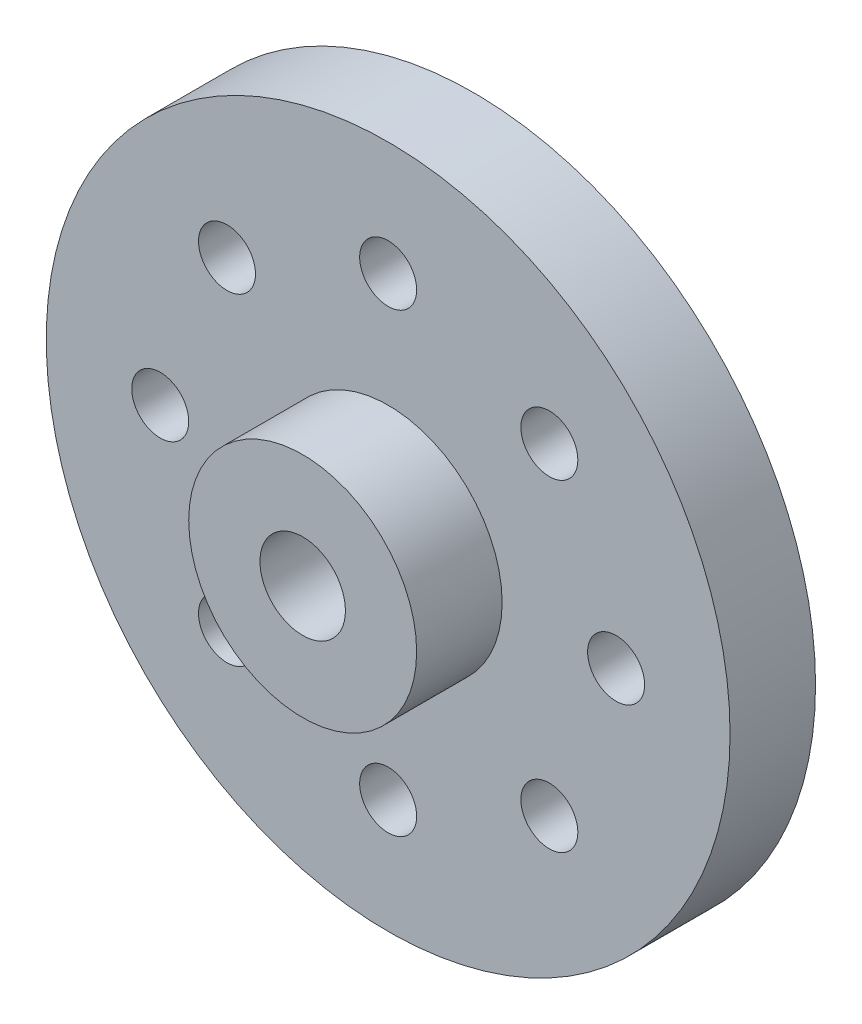
ISO-10303-21;
HEADER;
FILE_DESCRIPTION(('STEP AP214'),'2;1');
FILE_NAME('part.step','',(''),(''),'','','');
FILE_SCHEMA(('AUTOMOTIVE_DESIGN { 1 0 10303 214 1 1 1 1 }'));
ENDSEC;
DATA;
#1=APPLICATION_CONTEXT('core data for automotive mechanical design processes');
#2=APPLICATION_PROTOCOL_DEFINITION('international standard','automotive_design',2000,#1);
#3=PRODUCT_CONTEXT('',#1,'mechanical');
#4=PRODUCT('Part','Part','',(#3));
#5=PRODUCT_RELATED_PRODUCT_CATEGORY('part','',(#4));
#6=PRODUCT_DEFINITION_FORMATION('','',#4);
#7=PRODUCT_DEFINITION_CONTEXT('part definition',#1,'design');
#8=PRODUCT_DEFINITION('design','',#6,#7);
#9=PRODUCT_DEFINITION_SHAPE('','',#8);
#10=(LENGTH_UNIT() NAMED_UNIT(*) SI_UNIT(.MILLI.,.METRE.));
#11=(NAMED_UNIT(*) PLANE_ANGLE_UNIT() SI_UNIT($,.RADIAN.));
#12=(NAMED_UNIT(*) SI_UNIT($,.STERADIAN.) SOLID_ANGLE_UNIT());
#13=UNCERTAINTY_MEASURE_WITH_UNIT(LENGTH_MEASURE(1.E-05),#10,'distance_accuracy_value','');
#14=(GEOMETRIC_REPRESENTATION_CONTEXT(3) GLOBAL_UNCERTAINTY_ASSIGNED_CONTEXT((#13)) GLOBAL_UNIT_ASSIGNED_CONTEXT((#10,
#11,#12)) REPRESENTATION_CONTEXT('',''));
#15=CARTESIAN_POINT('',(0.,0.,0.));
#16=DIRECTION('',(0.,0.,1.));
#17=DIRECTION('',(1.,0.,0.));
#18=AXIS2_PLACEMENT_3D('',#15,#16,#17);
#19=CARTESIAN_POINT('',(0.,0.,3.));
#20=DIRECTION('',(0.,0.,1.));
#21=DIRECTION('',(1.,0.,0.));
#22=AXIS2_PLACEMENT_3D('',#19,#20,#21);
#23=PLANE('',#22);
#24=CARTESIAN_POINT('',(-5.65685424949225,5.65685424949206,3.));
#25=DIRECTION('',(0.,0.,1.));
#26=DIRECTION('',(1.,0.,0.));
#27=AXIS2_PLACEMENT_3D('',#24,#25,#26);
#28=CIRCLE('',#27,1.00000000000032);
#29=CARTESIAN_POINT('',(-4.65685424949193,5.65685424949206,3.));
#30=VERTEX_POINT('',#29);
#31=EDGE_CURVE('E108',#30,#30,#28,.T.);
#32=ORIENTED_EDGE('',*,*,#31,.F.);
#33=EDGE_LOOP('',(#32));
#34=FACE_BOUND('',#33,.T.);
#35=CARTESIAN_POINT('',(-5.65685424949161,-5.6568542494927,3.));
#36=DIRECTION('',(0.,0.,1.));
#37=DIRECTION('',(1.,0.,0.));
#38=AXIS2_PLACEMENT_3D('',#35,#36,#37);
#39=CIRCLE('',#38,1.0000000000009);
#40=CARTESIAN_POINT('',(-4.6568542494907,-5.6568542494927,3.));
#41=VERTEX_POINT('',#40);
#42=EDGE_CURVE('E92',#41,#41,#39,.T.);
#43=ORIENTED_EDGE('',*,*,#42,.F.);
#44=EDGE_LOOP('',(#43));
#45=FACE_BOUND('',#44,.T.);
#46=CARTESIAN_POINT('',(5.65685424949316,-5.65685424949206,3.));
#47=DIRECTION('',(0.,0.,1.));
#48=DIRECTION('',(1.,0.,0.));
#49=AXIS2_PLACEMENT_3D('',#46,#47,#48);
#50=CIRCLE('',#49,1.00000000000069);
#51=CARTESIAN_POINT('',(6.65685424949384,-5.65685424949206,3.));
#52=VERTEX_POINT('',#51);
#53=EDGE_CURVE('E76',#52,#52,#50,.T.);
#54=ORIENTED_EDGE('',*,*,#53,.F.);
#55=EDGE_LOOP('',(#54));
#56=FACE_BOUND('',#55,.T.);
#57=CARTESIAN_POINT('',(5.65685424949251,5.6568542494927,3.));
#58=DIRECTION('',(0.,0.,1.));
#59=DIRECTION('',(1.,0.,0.));
#60=AXIS2_PLACEMENT_3D('',#57,#58,#59);
#61=CIRCLE('',#60,1.00000000000005);
#62=CARTESIAN_POINT('',(6.65685424949256,5.6568542494927,3.));
#63=VERTEX_POINT('',#62);
#64=EDGE_CURVE('E63',#63,#63,#61,.T.);
#65=ORIENTED_EDGE('',*,*,#64,.F.);
#66=EDGE_LOOP('',(#65));
#67=FACE_BOUND('',#66,.T.);
#68=CARTESIAN_POINT('',(0.,8.,3.));
#69=DIRECTION('',(0.,0.,1.));
#70=DIRECTION('',(1.,0.,0.));
#71=AXIS2_PLACEMENT_3D('',#68,#69,#70);
#72=CIRCLE('',#71,1.);
#73=CARTESIAN_POINT('',(1.,8.,3.));
#74=VERTEX_POINT('',#73);
#75=EDGE_CURVE('E50',#74,#74,#72,.T.);
#76=ORIENTED_EDGE('',*,*,#75,.F.);
#77=EDGE_LOOP('',(#76));
#78=FACE_BOUND('',#77,.T.);
#79=CARTESIAN_POINT('',(0.,0.,3.));
#80=DIRECTION('',(0.,0.,1.));
#81=DIRECTION('',(1.,0.,0.));
#82=AXIS2_PLACEMENT_3D('',#79,#80,#81);
#83=CIRCLE('',#82,12.);
#84=CARTESIAN_POINT('',(12.,0.,3.));
#85=VERTEX_POINT('',#84);
#86=EDGE_CURVE('E10',#85,#85,#83,.T.);
#87=ORIENTED_EDGE('',*,*,#86,.T.);
#88=EDGE_LOOP('',(#87));
#89=FACE_BOUND('',#88,.T.);
#90=CARTESIAN_POINT('',(8.00000000000045,4.53767633447146E-13,3.));
#91=DIRECTION('',(0.,0.,1.));
#92=DIRECTION('',(1.,0.,0.));
#93=AXIS2_PLACEMENT_3D('',#90,#91,#92);
#94=CIRCLE('',#93,1.00000000000033);
#95=CARTESIAN_POINT('',(9.00000000000078,4.53767633447146E-13,3.));
#96=VERTEX_POINT('',#95);
#97=EDGE_CURVE('E68',#96,#96,#94,.T.);
#98=ORIENTED_EDGE('',*,*,#97,.F.);
#99=EDGE_LOOP('',(#98));
#100=FACE_BOUND('',#99,.T.);
#101=CARTESIAN_POINT('',(9.07535266894292E-13,-8.,3.));
#102=DIRECTION('',(0.,0.,1.));
#103=DIRECTION('',(1.,0.,0.));
#104=AXIS2_PLACEMENT_3D('',#101,#102,#103);
#105=CIRCLE('',#104,1.00000000000092);
#106=CARTESIAN_POINT('',(1.00000000000183,-8.,3.));
#107=VERTEX_POINT('',#106);
#108=EDGE_CURVE('E84',#107,#107,#105,.T.);
#109=ORIENTED_EDGE('',*,*,#108,.F.);
#110=EDGE_LOOP('',(#109));
#111=FACE_BOUND('',#110,.T.);
#112=CARTESIAN_POINT('',(-7.99999999999955,-4.54747350886464E-13,3.));
#113=DIRECTION('',(0.,0.,1.));
#114=DIRECTION('',(1.,0.,0.));
#115=AXIS2_PLACEMENT_3D('',#112,#113,#114);
#116=CIRCLE('',#115,1.00000000000065);
#117=CARTESIAN_POINT('',(-6.9999999999989,-4.54747350886464E-13,3.));
#118=VERTEX_POINT('',#117);
#119=EDGE_CURVE('E100',#118,#118,#116,.T.);
#120=ORIENTED_EDGE('',*,*,#119,.F.);
#121=EDGE_LOOP('',(#120));
#122=FACE_BOUND('',#121,.T.);
#123=CARTESIAN_POINT('',(0.,0.,3.));
#124=DIRECTION('',(0.,0.,1.));
#125=DIRECTION('',(1.,0.,0.));
#126=AXIS2_PLACEMENT_3D('',#123,#124,#125);
#127=CIRCLE('',#126,4.);
#128=CARTESIAN_POINT('',(4.,0.,3.));
#129=VERTEX_POINT('',#128);
#130=EDGE_CURVE('E120',#129,#129,#127,.T.);
#131=ORIENTED_EDGE('',*,*,#130,.F.);
#132=EDGE_LOOP('',(#131));
#133=FACE_BOUND('',#132,.T.);
#134=ADVANCED_FACE('F37',(#34,#45,#56,#67,#78,#89,#100,#111,#122,#133),#23,.T.);
#135=CARTESIAN_POINT('',(0.,0.,0.));
#136=DIRECTION('',(0.,0.,1.));
#137=DIRECTION('',(1.,0.,0.));
#138=AXIS2_PLACEMENT_3D('',#135,#136,#137);
#139=PLANE('',#138);
#140=CARTESIAN_POINT('',(0.,0.,0.));
#141=DIRECTION('',(0.,0.,1.));
#142=DIRECTION('',(1.,0.,0.));
#143=AXIS2_PLACEMENT_3D('',#140,#141,#142);
#144=CIRCLE('',#143,12.);
#145=CARTESIAN_POINT('',(12.,0.,0.));
#146=VERTEX_POINT('',#145);
#147=EDGE_CURVE('E41',#146,#146,#144,.T.);
#148=ORIENTED_EDGE('',*,*,#147,.F.);
#149=EDGE_LOOP('',(#148));
#150=FACE_BOUND('',#149,.T.);
#151=CARTESIAN_POINT('',(0.,8.,0.));
#152=DIRECTION('',(0.,0.,1.));
#153=DIRECTION('',(1.,0.,0.));
#154=AXIS2_PLACEMENT_3D('',#151,#152,#153);
#155=CIRCLE('',#154,1.);
#156=CARTESIAN_POINT('',(1.,8.,0.));
#157=VERTEX_POINT('',#156);
#158=EDGE_CURVE('E52',#157,#157,#155,.T.);
#159=ORIENTED_EDGE('',*,*,#158,.T.);
#160=EDGE_LOOP('',(#159));
#161=FACE_BOUND('',#160,.T.);
#162=CARTESIAN_POINT('',(0.,0.,0.));
#163=DIRECTION('',(0.,0.,1.));
#164=DIRECTION('',(1.,0.,0.));
#165=AXIS2_PLACEMENT_3D('',#162,#163,#164);
#166=CIRCLE('',#165,1.5);
#167=CARTESIAN_POINT('',(1.5,0.,0.));
#168=VERTEX_POINT('',#167);
#169=EDGE_CURVE('E56',#168,#168,#166,.T.);
#170=ORIENTED_EDGE('',*,*,#169,.T.);
#171=EDGE_LOOP('',(#170));
#172=FACE_BOUND('',#171,.T.);
#173=CARTESIAN_POINT('',(5.65685424949251,5.6568542494927,0.));
#174=DIRECTION('',(0.,0.,1.));
#175=DIRECTION('',(1.,0.,0.));
#176=AXIS2_PLACEMENT_3D('',#173,#174,#175);
#177=CIRCLE('',#176,1.00000000000005);
#178=CARTESIAN_POINT('',(6.65685424949256,5.6568542494927,0.));
#179=VERTEX_POINT('',#178);
#180=EDGE_CURVE('E64',#179,#179,#177,.T.);
#181=ORIENTED_EDGE('',*,*,#180,.T.);
#182=EDGE_LOOP('',(#181));
#183=FACE_BOUND('',#182,.T.);
#184=CARTESIAN_POINT('',(8.00000000000045,4.53767633447146E-13,0.));
#185=DIRECTION('',(0.,0.,1.));
#186=DIRECTION('',(1.,0.,0.));
#187=AXIS2_PLACEMENT_3D('',#184,#185,#186);
#188=CIRCLE('',#187,1.00000000000033);
#189=CARTESIAN_POINT('',(9.00000000000078,4.53767633447146E-13,0.));
#190=VERTEX_POINT('',#189);
#191=EDGE_CURVE('E72',#190,#190,#188,.T.);
#192=ORIENTED_EDGE('',*,*,#191,.T.);
#193=EDGE_LOOP('',(#192));
#194=FACE_BOUND('',#193,.T.);
#195=CARTESIAN_POINT('',(5.65685424949316,-5.65685424949206,0.));
#196=DIRECTION('',(0.,0.,1.));
#197=DIRECTION('',(1.,0.,0.));
#198=AXIS2_PLACEMENT_3D('',#195,#196,#197);
#199=CIRCLE('',#198,1.00000000000069);
#200=CARTESIAN_POINT('',(6.65685424949384,-5.65685424949206,0.));
#201=VERTEX_POINT('',#200);
#202=EDGE_CURVE('E80',#201,#201,#199,.T.);
#203=ORIENTED_EDGE('',*,*,#202,.T.);
#204=EDGE_LOOP('',(#203));
#205=FACE_BOUND('',#204,.T.);
#206=CARTESIAN_POINT('',(9.07535266894292E-13,-8.,0.));
#207=DIRECTION('',(0.,0.,1.));
#208=DIRECTION('',(1.,0.,0.));
#209=AXIS2_PLACEMENT_3D('',#206,#207,#208);
#210=CIRCLE('',#209,1.00000000000092);
#211=CARTESIAN_POINT('',(1.00000000000183,-8.,0.));
#212=VERTEX_POINT('',#211);
#213=EDGE_CURVE('E88',#212,#212,#210,.T.);
#214=ORIENTED_EDGE('',*,*,#213,.T.);
#215=EDGE_LOOP('',(#214));
#216=FACE_BOUND('',#215,.T.);
#217=CARTESIAN_POINT('',(-5.65685424949161,-5.6568542494927,0.));
#218=DIRECTION('',(0.,0.,1.));
#219=DIRECTION('',(1.,0.,0.));
#220=AXIS2_PLACEMENT_3D('',#217,#218,#219);
#221=CIRCLE('',#220,1.0000000000009);
#222=CARTESIAN_POINT('',(-4.6568542494907,-5.6568542494927,0.));
#223=VERTEX_POINT('',#222);
#224=EDGE_CURVE('E96',#223,#223,#221,.T.);
#225=ORIENTED_EDGE('',*,*,#224,.T.);
#226=EDGE_LOOP('',(#225));
#227=FACE_BOUND('',#226,.T.);
#228=CARTESIAN_POINT('',(-7.99999999999955,-4.54747350886464E-13,0.));
#229=DIRECTION('',(0.,0.,1.));
#230=DIRECTION('',(1.,0.,0.));
#231=AXIS2_PLACEMENT_3D('',#228,#229,#230);
#232=CIRCLE('',#231,1.00000000000065);
#233=CARTESIAN_POINT('',(-6.9999999999989,-4.54747350886464E-13,0.));
#234=VERTEX_POINT('',#233);
#235=EDGE_CURVE('E104',#234,#234,#232,.T.);
#236=ORIENTED_EDGE('',*,*,#235,.T.);
#237=EDGE_LOOP('',(#236));
#238=FACE_BOUND('',#237,.T.);
#239=CARTESIAN_POINT('',(-5.65685424949225,5.65685424949206,0.));
#240=DIRECTION('',(0.,0.,1.));
#241=DIRECTION('',(1.,0.,0.));
#242=AXIS2_PLACEMENT_3D('',#239,#240,#241);
#243=CIRCLE('',#242,1.00000000000032);
#244=CARTESIAN_POINT('',(-4.65685424949193,5.65685424949206,0.));
#245=VERTEX_POINT('',#244);
#246=EDGE_CURVE('E112',#245,#245,#243,.T.);
#247=ORIENTED_EDGE('',*,*,#246,.T.);
#248=EDGE_LOOP('',(#247));
#249=FACE_BOUND('',#248,.T.);
#250=ADVANCED_FACE('F150',(#150,#161,#172,#183,#194,#205,#216,#227,#238,#249),#139,.F.);
#251=CARTESIAN_POINT('',(0.,0.,3.));
#252=DIRECTION('',(0.,0.,-1.));
#253=DIRECTION('',(-1.,0.,0.));
#254=AXIS2_PLACEMENT_3D('',#251,#252,#253);
#255=CYLINDRICAL_SURFACE('',#254,12.);
#256=ORIENTED_EDGE('',*,*,#86,.F.);
#257=EDGE_LOOP('',(#256));
#258=FACE_BOUND('',#257,.T.);
#259=ORIENTED_EDGE('',*,*,#147,.T.);
#260=EDGE_LOOP('',(#259));
#261=FACE_BOUND('',#260,.T.);
#262=ADVANCED_FACE('F39',(#258,#261),#255,.T.);
#263=CARTESIAN_POINT('',(0.,8.,3.));
#264=DIRECTION('',(0.,0.,-1.));
#265=DIRECTION('',(-1.,0.,0.));
#266=AXIS2_PLACEMENT_3D('',#263,#264,#265);
#267=CYLINDRICAL_SURFACE('',#266,1.);
#268=ORIENTED_EDGE('',*,*,#75,.T.);
#269=EDGE_LOOP('',(#268));
#270=FACE_BOUND('',#269,.T.);
#271=ORIENTED_EDGE('',*,*,#158,.F.);
#272=EDGE_LOOP('',(#271));
#273=FACE_BOUND('',#272,.T.);
#274=ADVANCED_FACE('F160',(#270,#273),#267,.F.);
#275=CARTESIAN_POINT('',(0.,0.,3.));
#276=DIRECTION('',(0.,0.,-1.));
#277=DIRECTION('',(-1.,0.,0.));
#278=AXIS2_PLACEMENT_3D('',#275,#276,#277);
#279=CYLINDRICAL_SURFACE('',#278,1.5);
#280=ORIENTED_EDGE('',*,*,#169,.F.);
#281=EDGE_LOOP('',(#280));
#282=FACE_BOUND('',#281,.T.);
#283=CARTESIAN_POINT('',(0.,0.,6.));
#284=DIRECTION('',(0.,0.,1.));
#285=DIRECTION('',(1.,0.,0.));
#286=AXIS2_PLACEMENT_3D('',#283,#284,#285);
#287=CIRCLE('',#286,1.5);
#288=CARTESIAN_POINT('',(1.5,0.,6.));
#289=VERTEX_POINT('',#288);
#290=EDGE_CURVE('E124',#289,#289,#287,.T.);
#291=ORIENTED_EDGE('',*,*,#290,.T.);
#292=EDGE_LOOP('',(#291));
#293=FACE_BOUND('',#292,.T.);
#294=ADVANCED_FACE('F132',(#282,#293),#279,.F.);
#295=CARTESIAN_POINT('',(5.65685424949251,5.6568542494927,3.));
#296=DIRECTION('',(0.,0.,-1.));
#297=DIRECTION('',(-1.,0.,0.));
#298=AXIS2_PLACEMENT_3D('',#295,#296,#297);
#299=CYLINDRICAL_SURFACE('',#298,1.00000000000005);
#300=ORIENTED_EDGE('',*,*,#64,.T.);
#301=EDGE_LOOP('',(#300));
#302=FACE_BOUND('',#301,.T.);
#303=ORIENTED_EDGE('',*,*,#180,.F.);
#304=EDGE_LOOP('',(#303));
#305=FACE_BOUND('',#304,.T.);
#306=ADVANCED_FACE('F166',(#302,#305),#299,.F.);
#307=CARTESIAN_POINT('',(8.00000000000045,4.53767633447146E-13,3.));
#308=DIRECTION('',(0.,0.,-1.));
#309=DIRECTION('',(-1.,0.,0.));
#310=AXIS2_PLACEMENT_3D('',#307,#308,#309);
#311=CYLINDRICAL_SURFACE('',#310,1.00000000000033);
#312=ORIENTED_EDGE('',*,*,#97,.T.);
#313=EDGE_LOOP('',(#312));
#314=FACE_BOUND('',#313,.T.);
#315=ORIENTED_EDGE('',*,*,#191,.F.);
#316=EDGE_LOOP('',(#315));
#317=FACE_BOUND('',#316,.T.);
#318=ADVANCED_FACE('F170',(#314,#317),#311,.F.);
#319=CARTESIAN_POINT('',(5.65685424949316,-5.65685424949206,3.));
#320=DIRECTION('',(0.,0.,-1.));
#321=DIRECTION('',(-1.,0.,0.));
#322=AXIS2_PLACEMENT_3D('',#319,#320,#321);
#323=CYLINDRICAL_SURFACE('',#322,1.00000000000069);
#324=ORIENTED_EDGE('',*,*,#53,.T.);
#325=EDGE_LOOP('',(#324));
#326=FACE_BOUND('',#325,.T.);
#327=ORIENTED_EDGE('',*,*,#202,.F.);
#328=EDGE_LOOP('',(#327));
#329=FACE_BOUND('',#328,.T.);
#330=ADVANCED_FACE('F174',(#326,#329),#323,.F.);
#331=CARTESIAN_POINT('',(9.07535266894292E-13,-8.,3.));
#332=DIRECTION('',(0.,0.,-1.));
#333=DIRECTION('',(-1.,0.,0.));
#334=AXIS2_PLACEMENT_3D('',#331,#332,#333);
#335=CYLINDRICAL_SURFACE('',#334,1.00000000000092);
#336=ORIENTED_EDGE('',*,*,#108,.T.);
#337=EDGE_LOOP('',(#336));
#338=FACE_BOUND('',#337,.T.);
#339=ORIENTED_EDGE('',*,*,#213,.F.);
#340=EDGE_LOOP('',(#339));
#341=FACE_BOUND('',#340,.T.);
#342=ADVANCED_FACE('F178',(#338,#341),#335,.F.);
#343=CARTESIAN_POINT('',(-5.65685424949161,-5.6568542494927,3.));
#344=DIRECTION('',(0.,0.,-1.));
#345=DIRECTION('',(-1.,0.,0.));
#346=AXIS2_PLACEMENT_3D('',#343,#344,#345);
#347=CYLINDRICAL_SURFACE('',#346,1.0000000000009);
#348=ORIENTED_EDGE('',*,*,#42,.T.);
#349=EDGE_LOOP('',(#348));
#350=FACE_BOUND('',#349,.T.);
#351=ORIENTED_EDGE('',*,*,#224,.F.);
#352=EDGE_LOOP('',(#351));
#353=FACE_BOUND('',#352,.T.);
#354=ADVANCED_FACE('F182',(#350,#353),#347,.F.);
#355=CARTESIAN_POINT('',(-7.99999999999955,-4.54747350886464E-13,3.));
#356=DIRECTION('',(0.,0.,-1.));
#357=DIRECTION('',(-1.,0.,0.));
#358=AXIS2_PLACEMENT_3D('',#355,#356,#357);
#359=CYLINDRICAL_SURFACE('',#358,1.00000000000065);
#360=ORIENTED_EDGE('',*,*,#119,.T.);
#361=EDGE_LOOP('',(#360));
#362=FACE_BOUND('',#361,.T.);
#363=ORIENTED_EDGE('',*,*,#235,.F.);
#364=EDGE_LOOP('',(#363));
#365=FACE_BOUND('',#364,.T.);
#366=ADVANCED_FACE('F146',(#362,#365),#359,.F.);
#367=CARTESIAN_POINT('',(-5.65685424949225,5.65685424949206,3.));
#368=DIRECTION('',(0.,0.,-1.));
#369=DIRECTION('',(-1.,0.,0.));
#370=AXIS2_PLACEMENT_3D('',#367,#368,#369);
#371=CYLINDRICAL_SURFACE('',#370,1.00000000000032);
#372=ORIENTED_EDGE('',*,*,#31,.T.);
#373=EDGE_LOOP('',(#372));
#374=FACE_BOUND('',#373,.T.);
#375=ORIENTED_EDGE('',*,*,#246,.F.);
#376=EDGE_LOOP('',(#375));
#377=FACE_BOUND('',#376,.T.);
#378=ADVANCED_FACE('F137',(#374,#377),#371,.F.);
#379=CARTESIAN_POINT('',(0.,0.,6.));
#380=DIRECTION('',(0.,0.,1.));
#381=DIRECTION('',(1.,0.,0.));
#382=AXIS2_PLACEMENT_3D('',#379,#380,#381);
#383=PLANE('',#382);
#384=CARTESIAN_POINT('',(0.,0.,6.));
#385=DIRECTION('',(0.,0.,1.));
#386=DIRECTION('',(1.,0.,0.));
#387=AXIS2_PLACEMENT_3D('',#384,#385,#386);
#388=CIRCLE('',#387,4.);
#389=CARTESIAN_POINT('',(4.,0.,6.));
#390=VERTEX_POINT('',#389);
#391=EDGE_CURVE('E116',#390,#390,#388,.T.);
#392=ORIENTED_EDGE('',*,*,#391,.T.);
#393=EDGE_LOOP('',(#392));
#394=FACE_BOUND('',#393,.T.);
#395=ORIENTED_EDGE('',*,*,#290,.F.);
#396=EDGE_LOOP('',(#395));
#397=FACE_BOUND('',#396,.T.);
#398=ADVANCED_FACE('F134',(#394,#397),#383,.T.);
#399=CARTESIAN_POINT('',(0.,0.,6.));
#400=DIRECTION('',(0.,0.,-1.));
#401=DIRECTION('',(-1.,0.,0.));
#402=AXIS2_PLACEMENT_3D('',#399,#400,#401);
#403=CYLINDRICAL_SURFACE('',#402,4.);
#404=ORIENTED_EDGE('',*,*,#391,.F.);
#405=EDGE_LOOP('',(#404));
#406=FACE_BOUND('',#405,.T.);
#407=ORIENTED_EDGE('',*,*,#130,.T.);
#408=EDGE_LOOP('',(#407));
#409=FACE_BOUND('',#408,.T.);
#410=ADVANCED_FACE('F136',(#406,#409),#403,.T.);
#411=CLOSED_SHELL('',(#134,#250,#262,#274,#294,#306,#318,#330,#342,#354,#366,#378,#398,#410));
#412=MANIFOLD_SOLID_BREP('B2',#411);
#413=ADVANCED_BREP_SHAPE_REPRESENTATION('',(#18,#412),#14);
#414=SHAPE_DEFINITION_REPRESENTATION(#9,#413);
ENDSEC;
END-ISO-10303-21;
